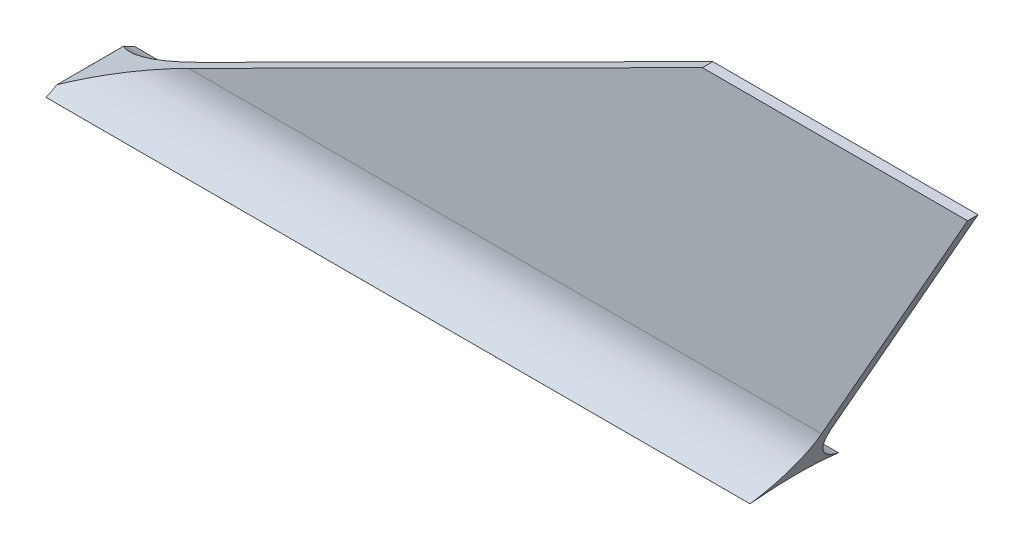
ISO-10303-21;
HEADER;
FILE_DESCRIPTION(('STEP AP214'),'2;1');
FILE_NAME('part.step','',(''),(''),'','','');
FILE_SCHEMA(('AUTOMOTIVE_DESIGN { 1 0 10303 214 1 1 1 1 }'));
ENDSEC;
DATA;
#1=APPLICATION_CONTEXT('core data for automotive mechanical design processes');
#2=APPLICATION_PROTOCOL_DEFINITION('international standard','automotive_design',2000,#1);
#3=PRODUCT_CONTEXT('',#1,'mechanical');
#4=PRODUCT('Part','Part','',(#3));
#5=PRODUCT_RELATED_PRODUCT_CATEGORY('part','',(#4));
#6=PRODUCT_DEFINITION_FORMATION('','',#4);
#7=PRODUCT_DEFINITION_CONTEXT('part definition',#1,'design');
#8=PRODUCT_DEFINITION('design','',#6,#7);
#9=PRODUCT_DEFINITION_SHAPE('','',#8);
#10=(LENGTH_UNIT() NAMED_UNIT(*) SI_UNIT(.MILLI.,.METRE.));
#11=(NAMED_UNIT(*) PLANE_ANGLE_UNIT() SI_UNIT($,.RADIAN.));
#12=(NAMED_UNIT(*) SI_UNIT($,.STERADIAN.) SOLID_ANGLE_UNIT());
#13=UNCERTAINTY_MEASURE_WITH_UNIT(LENGTH_MEASURE(1.E-05),#10,'distance_accuracy_value','');
#14=(GEOMETRIC_REPRESENTATION_CONTEXT(3) GLOBAL_UNCERTAINTY_ASSIGNED_CONTEXT((#13)) GLOBAL_UNIT_ASSIGNED_CONTEXT((#10,
#11,#12)) REPRESENTATION_CONTEXT('',''));
#15=CARTESIAN_POINT('',(0.,0.,0.));
#16=DIRECTION('',(0.,0.,1.));
#17=DIRECTION('',(1.,0.,0.));
#18=AXIS2_PLACEMENT_3D('',#15,#16,#17);
#19=CARTESIAN_POINT('',(76.9874,0.,2.9972));
#20=DIRECTION('',(0.,1.,0.));
#21=DIRECTION('',(-1.,0.,0.));
#22=AXIS2_PLACEMENT_3D('',#19,#20,#21);
#23=PLANE('',#22);
#24=DIRECTION('',(-1.,0.,0.));
#25=VECTOR('',#24,1.);
#26=CARTESIAN_POINT('',(230.108319396178,0.,0.0887261008157125));
#27=LINE('',#26,#25);
#28=CARTESIAN_POINT('',(76.9874,0.,0.0887261008155587));
#29=VERTEX_POINT('',#28);
#30=CARTESIAN_POINT('',(0.,0.,0.0887261008160208));
#31=VERTEX_POINT('',#30);
#32=EDGE_CURVE('E174',#29,#31,#27,.T.);
#33=ORIENTED_EDGE('',*,*,#32,.F.);
#34=DIRECTION('',(0.,0.,-1.));
#35=VECTOR('',#34,1.);
#36=CARTESIAN_POINT('',(76.9874,0.,2.9972));
#37=LINE('',#36,#35);
#38=CARTESIAN_POINT('',(76.9874,0.,2.90847389918444));
#39=VERTEX_POINT('',#38);
#40=EDGE_CURVE('E324',#39,#29,#37,.T.);
#41=ORIENTED_EDGE('',*,*,#40,.F.);
#42=DIRECTION('',(-1.,0.,0.));
#43=VECTOR('',#42,1.);
#44=CARTESIAN_POINT('',(230.108319396178,0.,2.90847389918429));
#45=LINE('',#44,#43);
#46=CARTESIAN_POINT('',(0.,0.,2.90847389918398));
#47=VERTEX_POINT('',#46);
#48=EDGE_CURVE('E246',#47,#39,#45,.F.);
#49=ORIENTED_EDGE('',*,*,#48,.F.);
#50=DIRECTION('',(0.,0.,-1.));
#51=VECTOR('',#50,1.);
#52=CARTESIAN_POINT('',(0.,0.,2.9972));
#53=LINE('',#52,#51);
#54=EDGE_CURVE('E279',#47,#31,#53,.T.);
#55=ORIENTED_EDGE('',*,*,#54,.T.);
#56=EDGE_LOOP('',(#33,#41,#49,#55));
#57=FACE_BOUND('',#56,.T.);
#58=ADVANCED_FACE('F40',(#57),#23,.F.);
#59=CARTESIAN_POINT('',(76.9874,-12.7,2.9972));
#60=DIRECTION('',(1.,0.,0.));
#61=DIRECTION('',(0.,0.,-1.));
#62=AXIS2_PLACEMENT_3D('',#59,#60,#61);
#63=PLANE('',#62);
#64=CARTESIAN_POINT('',(76.9874,-50.7778908388287,1.4986));
#65=DIRECTION('',(1.,0.,0.));
#66=DIRECTION('',(0.,0.,-1.));
#67=AXIS2_PLACEMENT_3D('',#64,#65,#66);
#68=CIRCLE('',#67,50.79746);
#69=CARTESIAN_POINT('',(76.9874,-0.00254110599471474,0.));
#70=VERTEX_POINT('',#69);
#71=EDGE_CURVE('E231',#70,#29,#68,.T.);
#72=ORIENTED_EDGE('',*,*,#71,.F.);
#73=DIRECTION('',(0.,-1.,0.));
#74=VECTOR('',#73,1.);
#75=CARTESIAN_POINT('',(76.9874,-12.7,0.));
#76=LINE('',#75,#74);
#77=CARTESIAN_POINT('',(76.9874,-12.7,0.));
#78=VERTEX_POINT('',#77);
#79=EDGE_CURVE('E257',#70,#78,#76,.T.);
#80=ORIENTED_EDGE('',*,*,#79,.T.);
#81=DIRECTION('',(0.,0.,-1.));
#82=VECTOR('',#81,1.);
#83=CARTESIAN_POINT('',(76.9874,-12.7,2.9972));
#84=LINE('',#83,#82);
#85=CARTESIAN_POINT('',(76.9874,-12.7,2.9972));
#86=VERTEX_POINT('',#85);
#87=EDGE_CURVE('E320',#86,#78,#84,.T.);
#88=ORIENTED_EDGE('',*,*,#87,.F.);
#89=DIRECTION('',(0.,-1.,0.));
#90=VECTOR('',#89,1.);
#91=CARTESIAN_POINT('',(76.9874,-12.7,2.9972));
#92=LINE('',#91,#90);
#93=CARTESIAN_POINT('',(76.9874,-0.00254110599471474,2.9972));
#94=VERTEX_POINT('',#93);
#95=EDGE_CURVE('E258',#94,#86,#92,.T.);
#96=ORIENTED_EDGE('',*,*,#95,.F.);
#97=EDGE_CURVE('E235',#39,#94,#68,.T.);
#98=ORIENTED_EDGE('',*,*,#97,.F.);
#99=ORIENTED_EDGE('',*,*,#40,.T.);
#100=EDGE_LOOP('',(#72,#80,#88,#96,#98,#99));
#101=FACE_BOUND('',#100,.T.);
#102=ADVANCED_FACE('F389',(#101),#63,.F.);
#103=CARTESIAN_POINT('',(127.,0.,2.9972));
#104=DIRECTION('',(-1.,0.,0.));
#105=DIRECTION('',(0.,0.,1.));
#106=AXIS2_PLACEMENT_3D('',#103,#104,#105);
#107=PLANE('',#106);
#108=CARTESIAN_POINT('',(127.,-50.7778908388287,1.4986));
#109=DIRECTION('',(-1.,0.,0.));
#110=DIRECTION('',(0.,0.,1.));
#111=AXIS2_PLACEMENT_3D('',#108,#109,#110);
#112=CIRCLE('',#111,50.79746);
#113=CARTESIAN_POINT('',(127.,-0.00254110599471474,2.9972));
#114=VERTEX_POINT('',#113);
#115=CARTESIAN_POINT('',(127.,0.,2.90847389918444));
#116=VERTEX_POINT('',#115);
#117=EDGE_CURVE('E232',#114,#116,#112,.T.);
#118=ORIENTED_EDGE('',*,*,#117,.F.);
#119=DIRECTION('',(0.,1.,0.));
#120=VECTOR('',#119,1.);
#121=CARTESIAN_POINT('',(127.,0.,2.9972));
#122=LINE('',#121,#120);
#123=CARTESIAN_POINT('',(127.,-12.7,2.9972));
#124=VERTEX_POINT('',#123);
#125=EDGE_CURVE('E265',#124,#114,#122,.T.);
#126=ORIENTED_EDGE('',*,*,#125,.F.);
#127=DIRECTION('',(0.,0.,-1.));
#128=VECTOR('',#127,1.);
#129=CARTESIAN_POINT('',(127.,-12.7,2.9972));
#130=LINE('',#129,#128);
#131=CARTESIAN_POINT('',(127.,-12.7,0.));
#132=VERTEX_POINT('',#131);
#133=EDGE_CURVE('E316',#124,#132,#130,.T.);
#134=ORIENTED_EDGE('',*,*,#133,.T.);
#135=DIRECTION('',(0.,1.,0.));
#136=VECTOR('',#135,1.);
#137=CARTESIAN_POINT('',(127.,0.,0.));
#138=LINE('',#137,#136);
#139=CARTESIAN_POINT('',(127.,-0.00254110599471474,0.));
#140=VERTEX_POINT('',#139);
#141=EDGE_CURVE('E285',#132,#140,#138,.T.);
#142=ORIENTED_EDGE('',*,*,#141,.T.);
#143=CARTESIAN_POINT('',(127.,0.,0.0887261008155594));
#144=VERTEX_POINT('',#143);
#145=EDGE_CURVE('E227',#144,#140,#112,.T.);
#146=ORIENTED_EDGE('',*,*,#145,.F.);
#147=DIRECTION('',(0.,0.,-1.));
#148=VECTOR('',#147,1.);
#149=CARTESIAN_POINT('',(127.,0.,2.9972));
#150=LINE('',#149,#148);
#151=EDGE_CURVE('E312',#116,#144,#150,.T.);
#152=ORIENTED_EDGE('',*,*,#151,.F.);
#153=EDGE_LOOP('',(#118,#126,#134,#142,#146,#152));
#154=FACE_BOUND('',#153,.T.);
#155=ADVANCED_FACE('F380',(#154),#107,.F.);
#156=CARTESIAN_POINT('',(203.2,0.,2.9972));
#157=DIRECTION('',(0.,1.,0.));
#158=DIRECTION('',(-1.,0.,0.));
#159=AXIS2_PLACEMENT_3D('',#156,#157,#158);
#160=PLANE('',#159);
#161=DIRECTION('',(-1.,0.,0.));
#162=VECTOR('',#161,1.);
#163=CARTESIAN_POINT('',(230.108319396178,0.,0.0887261008155587));
#164=LINE('',#163,#162);
#165=CARTESIAN_POINT('',(203.2,0.,0.0887261008162173));
#166=VERTEX_POINT('',#165);
#167=EDGE_CURVE('E242',#166,#144,#164,.T.);
#168=ORIENTED_EDGE('',*,*,#167,.F.);
#169=DIRECTION('',(0.,0.,-1.));
#170=VECTOR('',#169,1.);
#171=CARTESIAN_POINT('',(203.2,0.,2.9972));
#172=LINE('',#171,#170);
#173=CARTESIAN_POINT('',(203.2,0.,2.90847389918379));
#174=VERTEX_POINT('',#173);
#175=EDGE_CURVE('E308',#174,#166,#172,.T.);
#176=ORIENTED_EDGE('',*,*,#175,.F.);
#177=DIRECTION('',(-1.,0.,0.));
#178=VECTOR('',#177,1.);
#179=CARTESIAN_POINT('',(230.108319396178,0.,2.90847389918444));
#180=LINE('',#179,#178);
#181=EDGE_CURVE('E253',#116,#174,#180,.F.);
#182=ORIENTED_EDGE('',*,*,#181,.F.);
#183=ORIENTED_EDGE('',*,*,#151,.T.);
#184=EDGE_LOOP('',(#168,#176,#182,#183));
#185=FACE_BOUND('',#184,.T.);
#186=ADVANCED_FACE('F369',(#185),#160,.F.);
#187=CARTESIAN_POINT('',(0.,0.,2.9972));
#188=DIRECTION('',(0.448032667632685,-0.89401718592762,0.));
#189=DIRECTION('',(0.89401718592762,0.448032667632685,0.));
#190=AXIS2_PLACEMENT_3D('',#187,#188,#189);
#191=PLANE('',#190);
#192=CARTESIAN_POINT('',(-101.32365417668,-50.7778908388287,1.4986));
#193=DIRECTION('',(0.448032667632685,-0.89401718592762,0.));
#194=DIRECTION('',(-0.89401718592762,-0.448032667632685,0.));
#195=AXIS2_PLACEMENT_3D('',#192,#193,#194);
#196=ELLIPSE('',#195,113.378920042602,50.79746);
#197=EDGE_CURVE('E238',#31,#47,#196,.T.);
#198=ORIENTED_EDGE('',*,*,#197,.F.);
#199=ORIENTED_EDGE('',*,*,#54,.F.);
#200=EDGE_LOOP('',(#198,#199));
#201=FACE_BOUND('',#200,.T.);
#202=ADVANCED_FACE('F461',(#201),#191,.F.);
#203=CARTESIAN_POINT('',(0.,0.,2.9972));
#204=DIRECTION('',(0.,0.,1.));
#205=DIRECTION('',(1.,0.,0.));
#206=AXIS2_PLACEMENT_3D('',#203,#204,#205);
#207=PLANE('',#206);
#208=ORIENTED_EDGE('',*,*,#125,.T.);
#209=DIRECTION('',(-1.,0.,0.));
#210=VECTOR('',#209,1.);
#211=CARTESIAN_POINT('',(230.108319396178,-0.00254110599471474,2.9972));
#212=LINE('',#211,#210);
#213=EDGE_CURVE('E250',#114,#94,#212,.T.);
#214=ORIENTED_EDGE('',*,*,#213,.T.);
#215=ORIENTED_EDGE('',*,*,#95,.T.);
#216=DIRECTION('',(1.,0.,0.));
#217=VECTOR('',#216,1.);
#218=CARTESIAN_POINT('',(127.,-12.7,2.9972));
#219=LINE('',#218,#217);
#220=EDGE_CURVE('E261',#86,#124,#219,.T.);
#221=ORIENTED_EDGE('',*,*,#220,.T.);
#222=EDGE_LOOP('',(#208,#214,#215,#221));
#223=FACE_BOUND('',#222,.T.);
#224=ADVANCED_FACE('F425',(#223),#207,.T.);
#225=CARTESIAN_POINT('',(0.,0.,0.));
#226=DIRECTION('',(0.,0.,1.));
#227=DIRECTION('',(1.,0.,0.));
#228=AXIS2_PLACEMENT_3D('',#225,#226,#227);
#229=PLANE('',#228);
#230=DIRECTION('',(-1.,0.,0.));
#231=VECTOR('',#230,1.);
#232=CARTESIAN_POINT('',(230.108319396178,-0.00254110599471474,0.));
#233=LINE('',#232,#231);
#234=EDGE_CURVE('E328',#140,#70,#233,.T.);
#235=ORIENTED_EDGE('',*,*,#234,.F.);
#236=ORIENTED_EDGE('',*,*,#141,.F.);
#237=DIRECTION('',(1.,0.,0.));
#238=VECTOR('',#237,1.);
#239=CARTESIAN_POINT('',(127.,-12.7,0.));
#240=LINE('',#239,#238);
#241=EDGE_CURVE('E282',#78,#132,#240,.T.);
#242=ORIENTED_EDGE('',*,*,#241,.F.);
#243=ORIENTED_EDGE('',*,*,#79,.F.);
#244=EDGE_LOOP('',(#235,#236,#242,#243));
#245=FACE_BOUND('',#244,.T.);
#246=ADVANCED_FACE('F386',(#245),#229,.F.);
#247=CARTESIAN_POINT('',(127.,-12.7,2.9972));
#248=DIRECTION('',(0.,1.,0.));
#249=DIRECTION('',(-1.,0.,0.));
#250=AXIS2_PLACEMENT_3D('',#247,#248,#249);
#251=PLANE('',#250);
#252=ORIENTED_EDGE('',*,*,#241,.T.);
#253=ORIENTED_EDGE('',*,*,#133,.F.);
#254=ORIENTED_EDGE('',*,*,#220,.F.);
#255=ORIENTED_EDGE('',*,*,#87,.T.);
#256=EDGE_LOOP('',(#252,#253,#254,#255));
#257=FACE_BOUND('',#256,.T.);
#258=ADVANCED_FACE('F428',(#257),#251,.F.);
#259=CARTESIAN_POINT('',(253.5936,88.9,2.9972));
#260=DIRECTION('',(-0.869951100663055,0.493137995347286,0.));
#261=DIRECTION('',(-0.493137995347286,-0.869951100663055,0.));
#262=AXIS2_PLACEMENT_3D('',#259,#260,#261);
#263=PLANE('',#262);
#264=DIRECTION('',(0.493137995347286,0.869951100663055,0.));
#265=VECTOR('',#264,1.);
#266=CARTESIAN_POINT('',(253.5936,88.9,2.9972));
#267=LINE('',#266,#265);
#268=CARTESIAN_POINT('',(211.661579878137,14.9271822446966,2.9972));
#269=VERTEX_POINT('',#268);
#270=CARTESIAN_POINT('',(253.5936,88.9,2.9972));
#271=VERTEX_POINT('',#270);
#272=EDGE_CURVE('E269',#269,#271,#267,.T.);
#273=ORIENTED_EDGE('',*,*,#272,.F.);
#274=CARTESIAN_POINT('',(211.661579878137,14.9271822446967,20.7772));
#275=DIRECTION('',(-0.869951100663055,0.493137995347286,0.));
#276=DIRECTION('',(-0.493137995347286,-0.869951100663055,0.));
#277=AXIS2_PLACEMENT_3D('',#274,#275,#276);
#278=ELLIPSE('',#277,20.4379303462557,17.78);
#279=CARTESIAN_POINT('',(202.298128958138,-1.59100234199446,14.1986));
#280=VERTEX_POINT('',#279);
#281=EDGE_CURVE('E346',#269,#280,#278,.T.);
#282=ORIENTED_EDGE('',*,*,#281,.T.);
#283=DIRECTION('',(-0.48114932187635,-0.848801727100416,-0.219159663554402));
#284=VECTOR('',#283,1.);
#285=CARTESIAN_POINT('',(208.735246559524,9.76479987819213,17.130655525462));
#286=LINE('',#285,#284);
#287=CARTESIAN_POINT('',(202.296734861184,-1.59346168641931,14.197965));
#288=VERTEX_POINT('',#287);
#289=EDGE_CURVE('E218',#280,#288,#286,.T.);
#290=ORIENTED_EDGE('',*,*,#289,.T.);
#291=CARTESIAN_POINT('',(174.41618987879,-50.7778908388287,1.4986));
#292=DIRECTION('',(-0.869951100663055,0.493137995347286,0.));
#293=DIRECTION('',(-0.493137995347286,-0.869951100663055,0.));
#294=AXIS2_PLACEMENT_3D('',#291,#292,#293);
#295=ELLIPSE('',#294,58.3911669992526,50.79746);
#296=EDGE_CURVE('E364',#174,#288,#295,.F.);
#297=ORIENTED_EDGE('',*,*,#296,.F.);
#298=ORIENTED_EDGE('',*,*,#175,.T.);
#299=CARTESIAN_POINT('',(202.296734861184,-1.59346168641931,-11.200765));
#300=VERTEX_POINT('',#299);
#301=EDGE_CURVE('E223',#300,#166,#295,.F.);
#302=ORIENTED_EDGE('',*,*,#301,.F.);
#303=DIRECTION('',(0.481149321876287,0.848801727100305,-0.219159663554972));
#304=VECTOR('',#303,1.);
#305=CARTESIAN_POINT('',(208.736317916521,9.76668987289464,-14.1339435200038));
#306=LINE('',#305,#304);
#307=CARTESIAN_POINT('',(202.298128958138,-1.59100234199446,-11.2014));
#308=VERTEX_POINT('',#307);
#309=EDGE_CURVE('E190',#300,#308,#306,.T.);
#310=ORIENTED_EDGE('',*,*,#309,.T.);
#311=CARTESIAN_POINT('',(211.661579878137,14.9271822446966,-17.78));
#312=DIRECTION('',(-0.869951100663055,0.493137995347286,0.));
#313=DIRECTION('',(-0.493137995347286,-0.869951100663055,0.));
#314=AXIS2_PLACEMENT_3D('',#311,#312,#313);
#315=ELLIPSE('',#314,20.4379303462557,17.78);
#316=CARTESIAN_POINT('',(211.661579878137,14.9271822446966,0.));
#317=VERTEX_POINT('',#316);
#318=EDGE_CURVE('E339',#308,#317,#315,.T.);
#319=ORIENTED_EDGE('',*,*,#318,.T.);
#320=DIRECTION('',(0.493137995347286,0.869951100663055,0.));
#321=VECTOR('',#320,1.);
#322=CARTESIAN_POINT('',(253.5936,88.9,0.));
#323=LINE('',#322,#321);
#324=CARTESIAN_POINT('',(253.5936,88.9,0.));
#325=VERTEX_POINT('',#324);
#326=EDGE_CURVE('E289',#317,#325,#323,.T.);
#327=ORIENTED_EDGE('',*,*,#326,.T.);
#328=DIRECTION('',(0.,0.,-1.));
#329=VECTOR('',#328,1.);
#330=CARTESIAN_POINT('',(253.5936,88.9,2.9972));
#331=LINE('',#330,#329);
#332=EDGE_CURVE('E304',#271,#325,#331,.T.);
#333=ORIENTED_EDGE('',*,*,#332,.F.);
#334=EDGE_LOOP('',(#273,#282,#290,#297,#298,#302,#310,#319,#327,#333));
#335=FACE_BOUND('',#334,.T.);
#336=ADVANCED_FACE('F362',(#335),#263,.F.);
#337=CARTESIAN_POINT('',(177.3936,88.9,2.9972));
#338=DIRECTION('',(0.,-1.,0.));
#339=DIRECTION('',(0.,0.,-1.));
#340=AXIS2_PLACEMENT_3D('',#337,#338,#339);
#341=PLANE('',#340);
#342=DIRECTION('',(-1.,0.,0.));
#343=VECTOR('',#342,1.);
#344=CARTESIAN_POINT('',(177.3936,88.9,0.));
#345=LINE('',#344,#343);
#346=CARTESIAN_POINT('',(177.3936,88.9,0.));
#347=VERTEX_POINT('',#346);
#348=EDGE_CURVE('E292',#325,#347,#345,.T.);
#349=ORIENTED_EDGE('',*,*,#348,.T.);
#350=DIRECTION('',(0.,0.,-1.));
#351=VECTOR('',#350,1.);
#352=CARTESIAN_POINT('',(177.3936,88.9,2.9972));
#353=LINE('',#352,#351);
#354=CARTESIAN_POINT('',(177.3936,88.9,2.9972));
#355=VERTEX_POINT('',#354);
#356=EDGE_CURVE('E300',#355,#347,#353,.T.);
#357=ORIENTED_EDGE('',*,*,#356,.F.);
#358=DIRECTION('',(-1.,0.,0.));
#359=VECTOR('',#358,1.);
#360=CARTESIAN_POINT('',(177.3936,88.9,2.9972));
#361=LINE('',#360,#359);
#362=EDGE_CURVE('E272',#271,#355,#361,.T.);
#363=ORIENTED_EDGE('',*,*,#362,.F.);
#364=ORIENTED_EDGE('',*,*,#332,.T.);
#365=EDGE_LOOP('',(#349,#357,#363,#364));
#366=FACE_BOUND('',#365,.T.);
#367=ADVANCED_FACE('F411',(#366),#341,.F.);
#368=DIRECTION('',(-0.89401718592762,-0.448032667632685,0.));
#369=VECTOR('',#368,1.);
#370=CARTESIAN_POINT('',(0.,0.,0.));
#371=LINE('',#370,#369);
#372=CARTESIAN_POINT('',(29.7861259419889,14.9271822446966,0.));
#373=VERTEX_POINT('',#372);
#374=EDGE_CURVE('E262',#347,#373,#371,.T.);
#375=ORIENTED_EDGE('',*,*,#374,.T.);
#376=CARTESIAN_POINT('',(29.786125941989,14.9271822446966,-17.78));
#377=DIRECTION('',(0.448032667632685,-0.89401718592762,0.));
#378=DIRECTION('',(-0.89401718592762,-0.448032667632685,0.));
#379=AXIS2_PLACEMENT_3D('',#376,#377,#378);
#380=ELLIPSE('',#379,39.6846062452231,17.78);
#381=CARTESIAN_POINT('',(0.,0.,-8.12041252259635));
#382=VERTEX_POINT('',#381);
#383=EDGE_CURVE('E63',#373,#382,#380,.T.);
#384=ORIENTED_EDGE('',*,*,#383,.T.);
#385=DIRECTION('',(0.,0.,-1.));
#386=VECTOR('',#385,1.);
#387=CARTESIAN_POINT('',(0.,0.,1.4986));
#388=LINE('',#387,#386);
#389=CARTESIAN_POINT('',(0.,0.,0.));
#390=VERTEX_POINT('',#389);
#391=EDGE_CURVE('E49',#390,#382,#388,.T.);
#392=ORIENTED_EDGE('',*,*,#391,.F.);
#393=CARTESIAN_POINT('',(-101.32365417668,-50.7778908388287,1.4986));
#394=DIRECTION('',(0.448032667632685,-0.89401718592762,0.));
#395=DIRECTION('',(-0.89401718592762,-0.448032667632685,0.));
#396=AXIS2_PLACEMENT_3D('',#393,#394,#395);
#397=ELLIPSE('',#396,113.384589272066,50.8);
#398=CARTESIAN_POINT('',(0.,0.,2.9972));
#399=VERTEX_POINT('',#398);
#400=EDGE_CURVE('E222',#390,#399,#397,.T.);
#401=ORIENTED_EDGE('',*,*,#400,.T.);
#402=DIRECTION('',(0.,0.,1.));
#403=VECTOR('',#402,1.);
#404=CARTESIAN_POINT('',(0.,0.,2.9972));
#405=LINE('',#404,#403);
#406=CARTESIAN_POINT('',(0.,0.,11.1176125225964));
#407=VERTEX_POINT('',#406);
#408=EDGE_CURVE('E11',#399,#407,#405,.T.);
#409=ORIENTED_EDGE('',*,*,#408,.T.);
#410=CARTESIAN_POINT('',(29.786125941989,14.9271822446967,20.7772));
#411=DIRECTION('',(0.448032667632685,-0.89401718592762,0.));
#412=DIRECTION('',(-0.89401718592762,-0.448032667632685,0.));
#413=AXIS2_PLACEMENT_3D('',#410,#411,#412);
#414=ELLIPSE('',#413,39.6846062452231,17.78);
#415=CARTESIAN_POINT('',(29.786125941989,14.9271822446966,2.9972));
#416=VERTEX_POINT('',#415);
#417=EDGE_CURVE('E351',#407,#416,#414,.T.);
#418=ORIENTED_EDGE('',*,*,#417,.T.);
#419=DIRECTION('',(-0.89401718592762,-0.448032667632685,0.));
#420=VECTOR('',#419,1.);
#421=CARTESIAN_POINT('',(0.,0.,2.9972));
#422=LINE('',#421,#420);
#423=EDGE_CURVE('E275',#355,#416,#422,.T.);
#424=ORIENTED_EDGE('',*,*,#423,.F.);
#425=ORIENTED_EDGE('',*,*,#356,.T.);
#426=EDGE_LOOP('',(#375,#384,#392,#401,#409,#418,#424,#425));
#427=FACE_BOUND('',#426,.T.);
#428=ADVANCED_FACE('F404',(#427),#191,.F.);
#429=ORIENTED_EDGE('',*,*,#423,.T.);
#430=DIRECTION('',(1.,0.,0.));
#431=VECTOR('',#430,1.);
#432=CARTESIAN_POINT('',(203.2,14.9271822446967,2.9972));
#433=LINE('',#432,#431);
#434=EDGE_CURVE('E335',#416,#269,#433,.T.);
#435=ORIENTED_EDGE('',*,*,#434,.T.);
#436=ORIENTED_EDGE('',*,*,#272,.T.);
#437=ORIENTED_EDGE('',*,*,#362,.T.);
#438=EDGE_LOOP('',(#429,#435,#436,#437));
#439=FACE_BOUND('',#438,.T.);
#440=ADVANCED_FACE('F406',(#439),#207,.T.);
#441=ORIENTED_EDGE('',*,*,#326,.F.);
#442=DIRECTION('',(-1.,0.,0.));
#443=VECTOR('',#442,1.);
#444=CARTESIAN_POINT('',(0.,14.9271822446966,0.));
#445=LINE('',#444,#443);
#446=EDGE_CURVE('E332',#317,#373,#445,.T.);
#447=ORIENTED_EDGE('',*,*,#446,.T.);
#448=ORIENTED_EDGE('',*,*,#374,.F.);
#449=ORIENTED_EDGE('',*,*,#348,.F.);
#450=EDGE_LOOP('',(#441,#447,#448,#449));
#451=FACE_BOUND('',#450,.T.);
#452=ADVANCED_FACE('F415',(#451),#229,.F.);
#453=CARTESIAN_POINT('',(230.108319396178,-50.7778908388287,1.4986));
#454=DIRECTION('',(-1.,0.,0.));
#455=DIRECTION('',(0.,0.,1.));
#456=AXIS2_PLACEMENT_3D('',#453,#454,#455);
#457=CYLINDRICAL_SURFACE('',#456,50.79746);
#458=ORIENTED_EDGE('',*,*,#117,.T.);
#459=ORIENTED_EDGE('',*,*,#181,.T.);
#460=ORIENTED_EDGE('',*,*,#296,.T.);
#461=DIRECTION('',(-1.,0.,0.));
#462=VECTOR('',#461,1.);
#463=CARTESIAN_POINT('',(230.108319396178,-1.59346168641931,14.197965));
#464=LINE('',#463,#462);
#465=CARTESIAN_POINT('',(0.,-1.59346168641931,14.197965));
#466=VERTEX_POINT('',#465);
#467=EDGE_CURVE('E210',#288,#466,#464,.T.);
#468=ORIENTED_EDGE('',*,*,#467,.T.);
#469=CARTESIAN_POINT('',(0.,-50.7778908388287,1.4986));
#470=DIRECTION('',(1.,0.,0.));
#471=DIRECTION('',(0.,0.,-1.));
#472=AXIS2_PLACEMENT_3D('',#469,#470,#471);
#473=CIRCLE('',#472,50.79746);
#474=EDGE_CURVE('E181',#466,#47,#473,.F.);
#475=ORIENTED_EDGE('',*,*,#474,.T.);
#476=ORIENTED_EDGE('',*,*,#48,.T.);
#477=ORIENTED_EDGE('',*,*,#97,.T.);
#478=ORIENTED_EDGE('',*,*,#213,.F.);
#479=EDGE_LOOP('',(#458,#459,#460,#468,#475,#476,#477,#478));
#480=FACE_BOUND('',#479,.T.);
#481=ADVANCED_FACE('F376',(#480),#457,.F.);
#482=ORIENTED_EDGE('',*,*,#301,.T.);
#483=ORIENTED_EDGE('',*,*,#167,.T.);
#484=ORIENTED_EDGE('',*,*,#145,.T.);
#485=ORIENTED_EDGE('',*,*,#234,.T.);
#486=ORIENTED_EDGE('',*,*,#71,.T.);
#487=ORIENTED_EDGE('',*,*,#32,.T.);
#488=CARTESIAN_POINT('',(0.,-1.59346168641931,-11.200765));
#489=VERTEX_POINT('',#488);
#490=EDGE_CURVE('E168',#31,#489,#473,.F.);
#491=ORIENTED_EDGE('',*,*,#490,.T.);
#492=DIRECTION('',(-1.,0.,0.));
#493=VECTOR('',#492,1.);
#494=CARTESIAN_POINT('',(230.108319396178,-1.59346168641931,-11.200765));
#495=LINE('',#494,#493);
#496=EDGE_CURVE('E172',#300,#489,#495,.T.);
#497=ORIENTED_EDGE('',*,*,#496,.F.);
#498=EDGE_LOOP('',(#482,#483,#484,#485,#486,#487,#491,#497));
#499=FACE_BOUND('',#498,.T.);
#500=ADVANCED_FACE('F171',(#499),#457,.F.);
#501=EDGE_CURVE('E179',#47,#31,#473,.F.);
#502=ORIENTED_EDGE('',*,*,#501,.T.);
#503=ORIENTED_EDGE('',*,*,#197,.T.);
#504=EDGE_LOOP('',(#502,#503));
#505=FACE_BOUND('',#504,.T.);
#506=ADVANCED_FACE('F423',(#505),#457,.F.);
#507=CARTESIAN_POINT('',(230.108319396178,-50.7778908388287,1.4986));
#508=DIRECTION('',(-1.,0.,0.));
#509=DIRECTION('',(0.,0.,1.));
#510=AXIS2_PLACEMENT_3D('',#507,#508,#509);
#511=CYLINDRICAL_SURFACE('',#510,50.8);
#512=ORIENTED_EDGE('',*,*,#400,.F.);
#513=CARTESIAN_POINT('',(0.,-50.7778908388287,1.4986));
#514=DIRECTION('',(-1.,0.,0.));
#515=DIRECTION('',(0.,0.,1.));
#516=AXIS2_PLACEMENT_3D('',#513,#514,#515);
#517=CIRCLE('',#516,50.8);
#518=EDGE_CURVE('E199',#399,#390,#517,.T.);
#519=ORIENTED_EDGE('',*,*,#518,.F.);
#520=EDGE_LOOP('',(#512,#519));
#521=FACE_BOUND('',#520,.T.);
#522=ADVANCED_FACE('F448',(#521),#511,.T.);
#523=CARTESIAN_POINT('',(0.,-50.7778908388287,1.4986));
#524=DIRECTION('',(1.,0.,0.));
#525=DIRECTION('',(0.,0.,-1.));
#526=AXIS2_PLACEMENT_3D('',#523,#524,#525);
#527=PLANE('',#526);
#528=ORIENTED_EDGE('',*,*,#518,.T.);
#529=ORIENTED_EDGE('',*,*,#391,.T.);
#530=CARTESIAN_POINT('',(0.,14.9271822446966,-17.78));
#531=DIRECTION('',(1.,0.,0.));
#532=DIRECTION('',(0.,0.,-1.));
#533=AXIS2_PLACEMENT_3D('',#530,#531,#532);
#534=CIRCLE('',#533,17.78);
#535=CARTESIAN_POINT('',(0.,-1.59100234199446,-11.2014));
#536=VERTEX_POINT('',#535);
#537=EDGE_CURVE('E197',#382,#536,#534,.T.);
#538=ORIENTED_EDGE('',*,*,#537,.T.);
#539=DIRECTION('',(0.,-0.968245836551247,0.250000000002354));
#540=VECTOR('',#539,1.);
#541=CARTESIAN_POINT('',(0.,-1.59100234199446,-11.2014));
#542=LINE('',#541,#540);
#543=EDGE_CURVE('E187',#536,#489,#542,.T.);
#544=ORIENTED_EDGE('',*,*,#543,.T.);
#545=ORIENTED_EDGE('',*,*,#490,.F.);
#546=ORIENTED_EDGE('',*,*,#501,.F.);
#547=ORIENTED_EDGE('',*,*,#474,.F.);
#548=DIRECTION('',(0.,0.968245836551412,0.250000000001713));
#549=VECTOR('',#548,1.);
#550=CARTESIAN_POINT('',(0.,-1.59346168641931,14.197965));
#551=LINE('',#550,#549);
#552=CARTESIAN_POINT('',(0.,-1.59100234199446,14.1986));
#553=VERTEX_POINT('',#552);
#554=EDGE_CURVE('E203',#466,#553,#551,.T.);
#555=ORIENTED_EDGE('',*,*,#554,.T.);
#556=CARTESIAN_POINT('',(0.,14.9271822446967,20.7772));
#557=DIRECTION('',(1.,0.,0.));
#558=DIRECTION('',(0.,0.,-1.));
#559=AXIS2_PLACEMENT_3D('',#556,#557,#558);
#560=CIRCLE('',#559,17.78);
#561=EDGE_CURVE('E56',#553,#407,#560,.T.);
#562=ORIENTED_EDGE('',*,*,#561,.T.);
#563=ORIENTED_EDGE('',*,*,#408,.F.);
#564=EDGE_LOOP('',(#528,#529,#538,#544,#545,#546,#547,#555,#562,#563));
#565=FACE_BOUND('',#564,.T.);
#566=ADVANCED_FACE('F195',(#565),#527,.F.);
#567=CARTESIAN_POINT('',(230.108319396178,-1.59100234199446,-11.2014));
#568=DIRECTION('',(0.,-0.250000000002354,-0.968245836551246));
#569=DIRECTION('',(0.,0.968245836551247,-0.250000000002354));
#570=AXIS2_PLACEMENT_3D('',#567,#568,#569);
#571=PLANE('',#570);
#572=ORIENTED_EDGE('',*,*,#309,.F.);
#573=ORIENTED_EDGE('',*,*,#496,.T.);
#574=ORIENTED_EDGE('',*,*,#543,.F.);
#575=DIRECTION('',(-1.,0.,0.));
#576=VECTOR('',#575,1.);
#577=CARTESIAN_POINT('',(230.108319396178,-1.59100234199446,-11.2014));
#578=LINE('',#577,#576);
#579=EDGE_CURVE('E192',#308,#536,#578,.T.);
#580=ORIENTED_EDGE('',*,*,#579,.F.);
#581=EDGE_LOOP('',(#572,#573,#574,#580));
#582=FACE_BOUND('',#581,.T.);
#583=ADVANCED_FACE('F185',(#582),#571,.T.);
#584=CARTESIAN_POINT('',(230.108319396178,-1.59346168641931,14.197965));
#585=DIRECTION('',(0.,-0.250000000001713,0.968245836551412));
#586=DIRECTION('',(0.,-0.968245836551412,-0.250000000001713));
#587=AXIS2_PLACEMENT_3D('',#584,#585,#586);
#588=PLANE('',#587);
#589=ORIENTED_EDGE('',*,*,#289,.F.);
#590=DIRECTION('',(-1.,0.,0.));
#591=VECTOR('',#590,1.);
#592=CARTESIAN_POINT('',(230.108319396178,-1.59100234199446,14.1986));
#593=LINE('',#592,#591);
#594=EDGE_CURVE('E213',#280,#553,#593,.T.);
#595=ORIENTED_EDGE('',*,*,#594,.T.);
#596=ORIENTED_EDGE('',*,*,#554,.F.);
#597=ORIENTED_EDGE('',*,*,#467,.F.);
#598=EDGE_LOOP('',(#589,#595,#596,#597));
#599=FACE_BOUND('',#598,.T.);
#600=ADVANCED_FACE('F398',(#599),#588,.T.);
#601=CARTESIAN_POINT('',(230.108319396178,14.9271822446966,-17.78));
#602=DIRECTION('',(-1.,0.,0.));
#603=DIRECTION('',(0.,0.,1.));
#604=AXIS2_PLACEMENT_3D('',#601,#602,#603);
#605=CYLINDRICAL_SURFACE('',#604,17.78);
#606=ORIENTED_EDGE('',*,*,#383,.F.);
#607=ORIENTED_EDGE('',*,*,#446,.F.);
#608=ORIENTED_EDGE('',*,*,#318,.F.);
#609=ORIENTED_EDGE('',*,*,#579,.T.);
#610=ORIENTED_EDGE('',*,*,#537,.F.);
#611=EDGE_LOOP('',(#606,#607,#608,#609,#610));
#612=FACE_BOUND('',#611,.T.);
#613=ADVANCED_FACE('F357',(#612),#605,.F.);
#614=CARTESIAN_POINT('',(230.108319396178,14.9271822446967,20.7772));
#615=DIRECTION('',(-1.,0.,0.));
#616=DIRECTION('',(0.,0.,1.));
#617=AXIS2_PLACEMENT_3D('',#614,#615,#616);
#618=CYLINDRICAL_SURFACE('',#617,17.78);
#619=ORIENTED_EDGE('',*,*,#561,.F.);
#620=ORIENTED_EDGE('',*,*,#594,.F.);
#621=ORIENTED_EDGE('',*,*,#281,.F.);
#622=ORIENTED_EDGE('',*,*,#434,.F.);
#623=ORIENTED_EDGE('',*,*,#417,.F.);
#624=EDGE_LOOP('',(#619,#620,#621,#622,#623));
#625=FACE_BOUND('',#624,.T.);
#626=ADVANCED_FACE('F42',(#625),#618,.F.);
#627=CLOSED_SHELL('',(#58,#102,#155,#186,#202,#224,#246,#258,#336,#367,#428,#440,#452,#481,#500,
#506,#522,#566,#583,#600,#613,#626));
#628=MANIFOLD_SOLID_BREP('B2',#627);
#629=ADVANCED_BREP_SHAPE_REPRESENTATION('',(#18,#628),#14);
#630=SHAPE_DEFINITION_REPRESENTATION(#9,#629);
ENDSEC;
END-ISO-10303-21;
